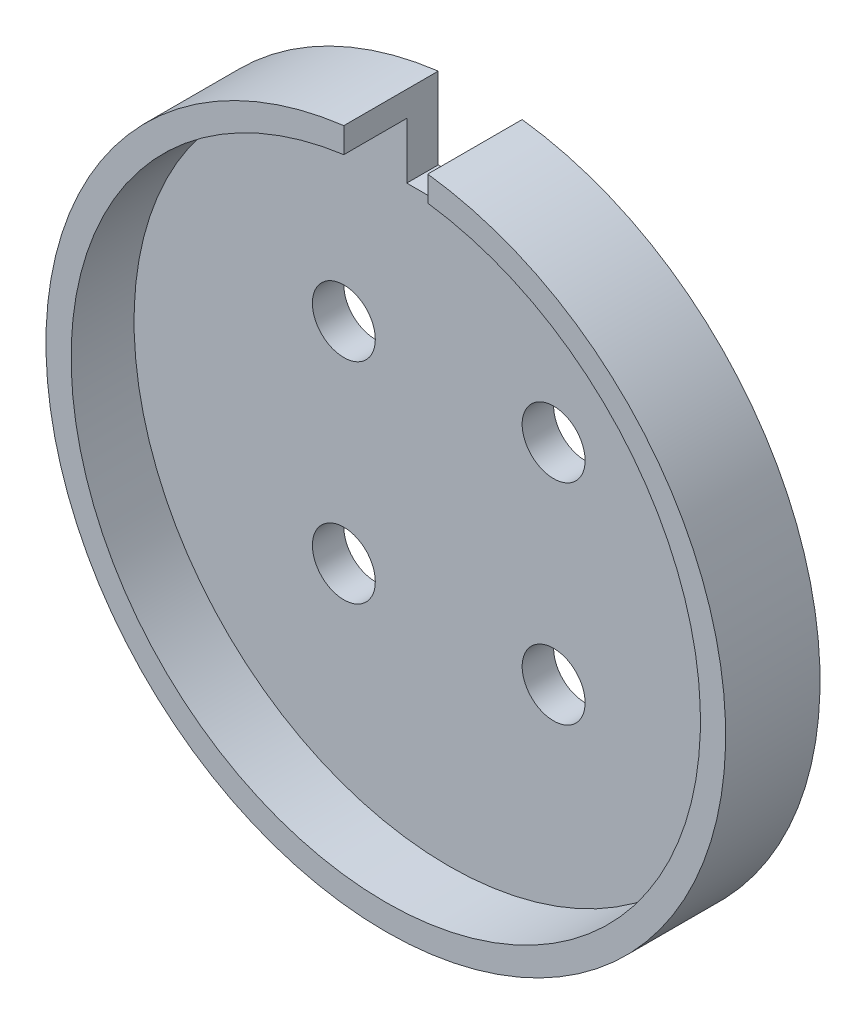
ISO-10303-21;
HEADER;
FILE_DESCRIPTION(('STEP AP214'),'2;1');
FILE_NAME('part.step','',(''),(''),'','','');
FILE_SCHEMA(('AUTOMOTIVE_DESIGN { 1 0 10303 214 1 1 1 1 }'));
ENDSEC;
DATA;
#1=APPLICATION_CONTEXT('core data for automotive mechanical design processes');
#2=APPLICATION_PROTOCOL_DEFINITION('international standard','automotive_design',2000,#1);
#3=PRODUCT_CONTEXT('',#1,'mechanical');
#4=PRODUCT('Part','Part','',(#3));
#5=PRODUCT_RELATED_PRODUCT_CATEGORY('part','',(#4));
#6=PRODUCT_DEFINITION_FORMATION('','',#4);
#7=PRODUCT_DEFINITION_CONTEXT('part definition',#1,'design');
#8=PRODUCT_DEFINITION('design','',#6,#7);
#9=PRODUCT_DEFINITION_SHAPE('','',#8);
#10=(LENGTH_UNIT() NAMED_UNIT(*) SI_UNIT(.MILLI.,.METRE.));
#11=(NAMED_UNIT(*) PLANE_ANGLE_UNIT() SI_UNIT($,.RADIAN.));
#12=(NAMED_UNIT(*) SI_UNIT($,.STERADIAN.) SOLID_ANGLE_UNIT());
#13=UNCERTAINTY_MEASURE_WITH_UNIT(LENGTH_MEASURE(1.E-05),#10,'distance_accuracy_value','');
#14=(GEOMETRIC_REPRESENTATION_CONTEXT(3) GLOBAL_UNCERTAINTY_ASSIGNED_CONTEXT((#13)) GLOBAL_UNIT_ASSIGNED_CONTEXT((#10,
#11,#12)) REPRESENTATION_CONTEXT('',''));
#15=CARTESIAN_POINT('',(0.,0.,0.));
#16=DIRECTION('',(0.,0.,1.));
#17=DIRECTION('',(1.,0.,0.));
#18=AXIS2_PLACEMENT_3D('',#15,#16,#17);
#19=CARTESIAN_POINT('',(-46.5214559661407,2.78795455574518,1.5));
#20=DIRECTION('',(0.,0.,-1.));
#21=DIRECTION('',(-1.,0.,0.));
#22=AXIS2_PLACEMENT_3D('',#19,#20,#21);
#23=PLANE('',#22);
#24=CARTESIAN_POINT('',(-41.5214559661408,7.78795455574518,1.5));
#25=DIRECTION('',(0.,0.,1.));
#26=DIRECTION('',(1.,0.,0.));
#27=AXIS2_PLACEMENT_3D('',#24,#25,#26);
#28=CIRCLE('',#27,1.5);
#29=CARTESIAN_POINT('',(-40.0214559661408,7.78795455574518,1.5));
#30=VERTEX_POINT('',#29);
#31=EDGE_CURVE('E134',#30,#30,#28,.T.);
#32=ORIENTED_EDGE('',*,*,#31,.F.);
#33=EDGE_LOOP('',(#32));
#34=FACE_BOUND('',#33,.T.);
#35=CARTESIAN_POINT('',(-51.5214559661408,7.78795455574511,1.5));
#36=DIRECTION('',(0.,0.,1.));
#37=DIRECTION('',(1.,0.,0.));
#38=AXIS2_PLACEMENT_3D('',#35,#36,#37);
#39=CIRCLE('',#38,1.5);
#40=CARTESIAN_POINT('',(-50.0214559661408,7.78795455574511,1.5));
#41=VERTEX_POINT('',#40);
#42=EDGE_CURVE('E143',#41,#41,#39,.T.);
#43=ORIENTED_EDGE('',*,*,#42,.F.);
#44=EDGE_LOOP('',(#43));
#45=FACE_BOUND('',#44,.T.);
#46=CARTESIAN_POINT('',(-51.5214559661407,-2.21204544425489,1.5));
#47=DIRECTION('',(0.,0.,1.));
#48=DIRECTION('',(1.,0.,0.));
#49=AXIS2_PLACEMENT_3D('',#46,#47,#48);
#50=CIRCLE('',#49,1.5);
#51=CARTESIAN_POINT('',(-50.0214559661407,-2.21204544425489,1.5));
#52=VERTEX_POINT('',#51);
#53=EDGE_CURVE('E149',#52,#52,#50,.T.);
#54=ORIENTED_EDGE('',*,*,#53,.F.);
#55=EDGE_LOOP('',(#54));
#56=FACE_BOUND('',#55,.T.);
#57=CARTESIAN_POINT('',(-41.5214559661407,-2.21204544425482,1.5));
#58=DIRECTION('',(0.,0.,1.));
#59=DIRECTION('',(1.,0.,0.));
#60=AXIS2_PLACEMENT_3D('',#57,#58,#59);
#61=CIRCLE('',#60,1.5);
#62=CARTESIAN_POINT('',(-40.0214559661407,-2.21204544425482,1.5));
#63=VERTEX_POINT('',#62);
#64=EDGE_CURVE('E102',#63,#63,#61,.T.);
#65=ORIENTED_EDGE('',*,*,#64,.F.);
#66=EDGE_LOOP('',(#65));
#67=FACE_BOUND('',#66,.T.);
#68=CARTESIAN_POINT('',(-46.522232832183,2.79785048504915,1.5));
#69=DIRECTION('',(0.,0.,-1.));
#70=DIRECTION('',(1.,0.,0.));
#71=AXIS2_PLACEMENT_3D('',#68,#69,#70);
#72=CIRCLE('',#71,15.);
#73=CARTESIAN_POINT('',(-44.5214559661407,17.6638146963713,1.5));
#74=VERTEX_POINT('',#73);
#75=CARTESIAN_POINT('',(-48.5214559661407,17.664023727032,1.5));
#76=VERTEX_POINT('',#75);
#77=EDGE_CURVE('E48',#74,#76,#72,.T.);
#78=ORIENTED_EDGE('',*,*,#77,.F.);
#79=DIRECTION('',(0.,-1.,0.));
#80=VECTOR('',#79,1.);
#81=CARTESIAN_POINT('',(-44.5214559661407,14.9903333843826,1.5));
#82=LINE('',#81,#80);
#83=CARTESIAN_POINT('',(-44.5214559661407,14.9903333843826,1.5));
#84=VERTEX_POINT('',#83);
#85=EDGE_CURVE('E86',#74,#84,#82,.T.);
#86=ORIENTED_EDGE('',*,*,#85,.T.);
#87=DIRECTION('',(-1.,0.,0.));
#88=VECTOR('',#87,1.);
#89=CARTESIAN_POINT('',(-44.5214559661407,14.9903333843826,1.5));
#90=LINE('',#89,#88);
#91=CARTESIAN_POINT('',(-48.5214559661407,14.9903333843826,1.5));
#92=VERTEX_POINT('',#91);
#93=EDGE_CURVE('E54',#84,#92,#90,.T.);
#94=ORIENTED_EDGE('',*,*,#93,.T.);
#95=DIRECTION('',(0.,1.,0.));
#96=VECTOR('',#95,1.);
#97=CARTESIAN_POINT('',(-48.5214559661407,14.9903333843826,1.5));
#98=LINE('',#97,#96);
#99=EDGE_CURVE('E97',#92,#76,#98,.T.);
#100=ORIENTED_EDGE('',*,*,#99,.T.);
#101=EDGE_LOOP('',(#78,#86,#94,#100));
#102=FACE_BOUND('',#101,.T.);
#103=ADVANCED_FACE('F33',(#34,#45,#56,#67,#102),#23,.F.);
#104=CARTESIAN_POINT('',(-46.5214559661407,2.78795455574518,0.));
#105=DIRECTION('',(0.,0.,-1.));
#106=DIRECTION('',(-1.,0.,0.));
#107=AXIS2_PLACEMENT_3D('',#104,#105,#106);
#108=PLANE('',#107);
#109=CARTESIAN_POINT('',(-51.5214559661408,7.78795455574511,0.));
#110=DIRECTION('',(0.,0.,1.));
#111=DIRECTION('',(1.,0.,0.));
#112=AXIS2_PLACEMENT_3D('',#109,#110,#111);
#113=CIRCLE('',#112,1.5);
#114=CARTESIAN_POINT('',(-50.0214559661408,7.78795455574511,0.));
#115=VERTEX_POINT('',#114);
#116=EDGE_CURVE('E141',#115,#115,#113,.T.);
#117=ORIENTED_EDGE('',*,*,#116,.T.);
#118=EDGE_LOOP('',(#117));
#119=FACE_BOUND('',#118,.T.);
#120=CARTESIAN_POINT('',(-41.5214559661407,-2.21204544425482,0.));
#121=DIRECTION('',(0.,0.,1.));
#122=DIRECTION('',(1.,0.,0.));
#123=AXIS2_PLACEMENT_3D('',#120,#121,#122);
#124=CIRCLE('',#123,1.5);
#125=CARTESIAN_POINT('',(-40.0214559661407,-2.21204544425482,0.));
#126=VERTEX_POINT('',#125);
#127=EDGE_CURVE('E106',#126,#126,#124,.T.);
#128=ORIENTED_EDGE('',*,*,#127,.T.);
#129=EDGE_LOOP('',(#128));
#130=FACE_BOUND('',#129,.T.);
#131=DIRECTION('',(0.,-1.,0.));
#132=VECTOR('',#131,1.);
#133=CARTESIAN_POINT('',(-44.5214559661407,14.9903333843826,0.));
#134=LINE('',#133,#132);
#135=CARTESIAN_POINT('',(-44.5214559661407,18.864023727032,0.));
#136=VERTEX_POINT('',#135);
#137=CARTESIAN_POINT('',(-44.5214559661407,14.9903333843826,0.));
#138=VERTEX_POINT('',#137);
#139=EDGE_CURVE('E92',#136,#138,#134,.T.);
#140=ORIENTED_EDGE('',*,*,#139,.F.);
#141=CARTESIAN_POINT('',(-46.5214559661407,2.78795455574518,0.));
#142=DIRECTION('',(0.,0.,1.));
#143=DIRECTION('',(-1.,0.,0.));
#144=AXIS2_PLACEMENT_3D('',#141,#142,#143);
#145=CIRCLE('',#144,16.2);
#146=CARTESIAN_POINT('',(-48.5214559661407,18.864023727032,0.));
#147=VERTEX_POINT('',#146);
#148=EDGE_CURVE('E74',#147,#136,#145,.T.);
#149=ORIENTED_EDGE('',*,*,#148,.F.);
#150=DIRECTION('',(0.,1.,0.));
#151=VECTOR('',#150,1.);
#152=CARTESIAN_POINT('',(-48.5214559661407,14.9903333843826,0.));
#153=LINE('',#152,#151);
#154=CARTESIAN_POINT('',(-48.5214559661407,14.9903333843826,0.));
#155=VERTEX_POINT('',#154);
#156=EDGE_CURVE('E87',#155,#147,#153,.T.);
#157=ORIENTED_EDGE('',*,*,#156,.F.);
#158=DIRECTION('',(-1.,0.,0.));
#159=VECTOR('',#158,1.);
#160=CARTESIAN_POINT('',(-44.5214559661407,14.9903333843826,0.));
#161=LINE('',#160,#159);
#162=EDGE_CURVE('E101',#138,#155,#161,.T.);
#163=ORIENTED_EDGE('',*,*,#162,.F.);
#164=EDGE_LOOP('',(#140,#149,#157,#163));
#165=FACE_BOUND('',#164,.T.);
#166=CARTESIAN_POINT('',(-51.5214559661407,-2.21204544425489,0.));
#167=DIRECTION('',(0.,0.,1.));
#168=DIRECTION('',(1.,0.,0.));
#169=AXIS2_PLACEMENT_3D('',#166,#167,#168);
#170=CIRCLE('',#169,1.5);
#171=CARTESIAN_POINT('',(-50.0214559661407,-2.21204544425489,0.));
#172=VERTEX_POINT('',#171);
#173=EDGE_CURVE('E146',#172,#172,#170,.T.);
#174=ORIENTED_EDGE('',*,*,#173,.T.);
#175=EDGE_LOOP('',(#174));
#176=FACE_BOUND('',#175,.T.);
#177=CARTESIAN_POINT('',(-41.5214559661408,7.78795455574518,0.));
#178=DIRECTION('',(0.,0.,1.));
#179=DIRECTION('',(1.,0.,0.));
#180=AXIS2_PLACEMENT_3D('',#177,#178,#179);
#181=CIRCLE('',#180,1.5);
#182=CARTESIAN_POINT('',(-40.0214559661408,7.78795455574518,0.));
#183=VERTEX_POINT('',#182);
#184=EDGE_CURVE('E130',#183,#183,#181,.T.);
#185=ORIENTED_EDGE('',*,*,#184,.T.);
#186=EDGE_LOOP('',(#185));
#187=FACE_BOUND('',#186,.T.);
#188=ADVANCED_FACE('F99',(#119,#130,#165,#176,#187),#108,.T.);
#189=CARTESIAN_POINT('',(-44.5214559661407,14.9903333843826,1.5));
#190=DIRECTION('',(1.,0.,0.));
#191=DIRECTION('',(0.,0.,-1.));
#192=AXIS2_PLACEMENT_3D('',#189,#190,#191);
#193=PLANE('',#192);
#194=ORIENTED_EDGE('',*,*,#139,.T.);
#195=DIRECTION('',(0.,0.,-1.));
#196=VECTOR('',#195,1.);
#197=CARTESIAN_POINT('',(-44.5214559661407,14.9903333843826,1.5));
#198=LINE('',#197,#196);
#199=EDGE_CURVE('E11',#84,#138,#198,.T.);
#200=ORIENTED_EDGE('',*,*,#199,.F.);
#201=ORIENTED_EDGE('',*,*,#85,.F.);
#202=DIRECTION('',(0.,0.,-1.));
#203=VECTOR('',#202,1.);
#204=CARTESIAN_POINT('',(-44.5214559661407,17.6638146963713,4.5));
#205=LINE('',#204,#203);
#206=CARTESIAN_POINT('',(-44.5214559661407,17.6638146963713,4.5));
#207=VERTEX_POINT('',#206);
#208=EDGE_CURVE('E121',#207,#74,#205,.T.);
#209=ORIENTED_EDGE('',*,*,#208,.F.);
#210=DIRECTION('',(0.,-1.,0.));
#211=VECTOR('',#210,1.);
#212=CARTESIAN_POINT('',(-44.5214559661407,18.864023727032,4.5));
#213=LINE('',#212,#211);
#214=CARTESIAN_POINT('',(-44.5214559661407,18.864023727032,4.5));
#215=VERTEX_POINT('',#214);
#216=EDGE_CURVE('E95',#215,#207,#213,.T.);
#217=ORIENTED_EDGE('',*,*,#216,.F.);
#218=DIRECTION('',(0.,0.,-1.));
#219=VECTOR('',#218,1.);
#220=CARTESIAN_POINT('',(-44.5214559661407,18.864023727032,1.5));
#221=LINE('',#220,#219);
#222=EDGE_CURVE('E79',#215,#136,#221,.T.);
#223=ORIENTED_EDGE('',*,*,#222,.T.);
#224=EDGE_LOOP('',(#194,#200,#201,#209,#217,#223));
#225=FACE_BOUND('',#224,.T.);
#226=ADVANCED_FACE('F35',(#225),#193,.F.);
#227=CARTESIAN_POINT('',(-44.5214559661407,14.9903333843826,1.5));
#228=DIRECTION('',(0.,-1.,0.));
#229=DIRECTION('',(1.,0.,0.));
#230=AXIS2_PLACEMENT_3D('',#227,#228,#229);
#231=PLANE('',#230);
#232=ORIENTED_EDGE('',*,*,#162,.T.);
#233=DIRECTION('',(0.,0.,-1.));
#234=VECTOR('',#233,1.);
#235=CARTESIAN_POINT('',(-48.5214559661407,14.9903333843826,1.5));
#236=LINE('',#235,#234);
#237=EDGE_CURVE('E41',#92,#155,#236,.T.);
#238=ORIENTED_EDGE('',*,*,#237,.F.);
#239=ORIENTED_EDGE('',*,*,#93,.F.);
#240=ORIENTED_EDGE('',*,*,#199,.T.);
#241=EDGE_LOOP('',(#232,#238,#239,#240));
#242=FACE_BOUND('',#241,.T.);
#243=ADVANCED_FACE('F118',(#242),#231,.F.);
#244=CARTESIAN_POINT('',(-48.5214559661407,14.9903333843826,1.5));
#245=DIRECTION('',(-1.,0.,0.));
#246=DIRECTION('',(0.,0.,1.));
#247=AXIS2_PLACEMENT_3D('',#244,#245,#246);
#248=PLANE('',#247);
#249=ORIENTED_EDGE('',*,*,#156,.T.);
#250=DIRECTION('',(0.,0.,-1.));
#251=VECTOR('',#250,1.);
#252=CARTESIAN_POINT('',(-48.5214559661407,18.864023727032,1.5));
#253=LINE('',#252,#251);
#254=CARTESIAN_POINT('',(-48.5214559661407,18.864023727032,4.5));
#255=VERTEX_POINT('',#254);
#256=EDGE_CURVE('E82',#255,#147,#253,.T.);
#257=ORIENTED_EDGE('',*,*,#256,.F.);
#258=DIRECTION('',(0.,1.,0.));
#259=VECTOR('',#258,1.);
#260=CARTESIAN_POINT('',(-48.5214559661407,18.864023727032,4.5));
#261=LINE('',#260,#259);
#262=CARTESIAN_POINT('',(-48.5214559661407,17.664023727032,4.5));
#263=VERTEX_POINT('',#262);
#264=EDGE_CURVE('E136',#263,#255,#261,.T.);
#265=ORIENTED_EDGE('',*,*,#264,.F.);
#266=DIRECTION('',(0.,0.,-1.));
#267=VECTOR('',#266,1.);
#268=CARTESIAN_POINT('',(-48.5214559661407,17.664023727032,4.5));
#269=LINE('',#268,#267);
#270=EDGE_CURVE('E131',#263,#76,#269,.T.);
#271=ORIENTED_EDGE('',*,*,#270,.T.);
#272=ORIENTED_EDGE('',*,*,#99,.F.);
#273=ORIENTED_EDGE('',*,*,#237,.T.);
#274=EDGE_LOOP('',(#249,#257,#265,#271,#272,#273));
#275=FACE_BOUND('',#274,.T.);
#276=ADVANCED_FACE('F115',(#275),#248,.F.);
#277=CARTESIAN_POINT('',(-46.5214559661407,2.78795455574518,1.5));
#278=DIRECTION('',(0.,0.,-1.));
#279=DIRECTION('',(-1.,0.,0.));
#280=AXIS2_PLACEMENT_3D('',#277,#278,#279);
#281=CYLINDRICAL_SURFACE('',#280,16.2);
#282=ORIENTED_EDGE('',*,*,#148,.T.);
#283=ORIENTED_EDGE('',*,*,#222,.F.);
#284=CARTESIAN_POINT('',(-46.5214559661407,2.78795455574517,4.5));
#285=DIRECTION('',(0.,0.,1.));
#286=DIRECTION('',(1.,0.,0.));
#287=AXIS2_PLACEMENT_3D('',#284,#285,#286);
#288=CIRCLE('',#287,16.2);
#289=EDGE_CURVE('E163',#255,#215,#288,.T.);
#290=ORIENTED_EDGE('',*,*,#289,.F.);
#291=ORIENTED_EDGE('',*,*,#256,.T.);
#292=EDGE_LOOP('',(#282,#283,#290,#291));
#293=FACE_BOUND('',#292,.T.);
#294=ADVANCED_FACE('F76',(#293),#281,.T.);
#295=CARTESIAN_POINT('',(-41.5214559661407,-2.21204544425482,1.5));
#296=DIRECTION('',(0.,0.,-1.));
#297=DIRECTION('',(-1.,0.,0.));
#298=AXIS2_PLACEMENT_3D('',#295,#296,#297);
#299=CYLINDRICAL_SURFACE('',#298,1.5);
#300=ORIENTED_EDGE('',*,*,#64,.T.);
#301=EDGE_LOOP('',(#300));
#302=FACE_BOUND('',#301,.T.);
#303=ORIENTED_EDGE('',*,*,#127,.F.);
#304=EDGE_LOOP('',(#303));
#305=FACE_BOUND('',#304,.T.);
#306=ADVANCED_FACE('F187',(#302,#305),#299,.F.);
#307=CARTESIAN_POINT('',(-51.5214559661407,-2.21204544425489,1.5));
#308=DIRECTION('',(0.,0.,-1.));
#309=DIRECTION('',(-1.,0.,0.));
#310=AXIS2_PLACEMENT_3D('',#307,#308,#309);
#311=CYLINDRICAL_SURFACE('',#310,1.5);
#312=ORIENTED_EDGE('',*,*,#53,.T.);
#313=EDGE_LOOP('',(#312));
#314=FACE_BOUND('',#313,.T.);
#315=ORIENTED_EDGE('',*,*,#173,.F.);
#316=EDGE_LOOP('',(#315));
#317=FACE_BOUND('',#316,.T.);
#318=ADVANCED_FACE('F219',(#314,#317),#311,.F.);
#319=CARTESIAN_POINT('',(-51.5214559661408,7.78795455574511,1.5));
#320=DIRECTION('',(0.,0.,-1.));
#321=DIRECTION('',(-1.,0.,0.));
#322=AXIS2_PLACEMENT_3D('',#319,#320,#321);
#323=CYLINDRICAL_SURFACE('',#322,1.5);
#324=ORIENTED_EDGE('',*,*,#42,.T.);
#325=EDGE_LOOP('',(#324));
#326=FACE_BOUND('',#325,.T.);
#327=ORIENTED_EDGE('',*,*,#116,.F.);
#328=EDGE_LOOP('',(#327));
#329=FACE_BOUND('',#328,.T.);
#330=ADVANCED_FACE('F229',(#326,#329),#323,.F.);
#331=CARTESIAN_POINT('',(-41.5214559661408,7.78795455574518,1.5));
#332=DIRECTION('',(0.,0.,-1.));
#333=DIRECTION('',(-1.,0.,0.));
#334=AXIS2_PLACEMENT_3D('',#331,#332,#333);
#335=CYLINDRICAL_SURFACE('',#334,1.5);
#336=ORIENTED_EDGE('',*,*,#31,.T.);
#337=EDGE_LOOP('',(#336));
#338=FACE_BOUND('',#337,.T.);
#339=ORIENTED_EDGE('',*,*,#184,.F.);
#340=EDGE_LOOP('',(#339));
#341=FACE_BOUND('',#340,.T.);
#342=ADVANCED_FACE('F174',(#338,#341),#335,.F.);
#343=CARTESIAN_POINT('',(-46.522232832183,2.79785048504915,4.5));
#344=DIRECTION('',(0.,0.,-1.));
#345=DIRECTION('',(-1.,0.,0.));
#346=AXIS2_PLACEMENT_3D('',#343,#344,#345);
#347=CYLINDRICAL_SURFACE('',#346,15.);
#348=ORIENTED_EDGE('',*,*,#77,.T.);
#349=ORIENTED_EDGE('',*,*,#270,.F.);
#350=CARTESIAN_POINT('',(-46.522232832183,2.79785048504915,4.5));
#351=DIRECTION('',(0.,0.,-1.));
#352=DIRECTION('',(1.,0.,0.));
#353=AXIS2_PLACEMENT_3D('',#350,#351,#352);
#354=CIRCLE('',#353,15.);
#355=EDGE_CURVE('E129',#207,#263,#354,.T.);
#356=ORIENTED_EDGE('',*,*,#355,.F.);
#357=ORIENTED_EDGE('',*,*,#208,.T.);
#358=EDGE_LOOP('',(#348,#349,#356,#357));
#359=FACE_BOUND('',#358,.T.);
#360=ADVANCED_FACE('F125',(#359),#347,.F.);
#361=CARTESIAN_POINT('',(-46.5214559661407,2.78795455574517,4.5));
#362=DIRECTION('',(0.,0.,1.));
#363=DIRECTION('',(1.,0.,0.));
#364=AXIS2_PLACEMENT_3D('',#361,#362,#363);
#365=PLANE('',#364);
#366=ORIENTED_EDGE('',*,*,#289,.T.);
#367=ORIENTED_EDGE('',*,*,#216,.T.);
#368=ORIENTED_EDGE('',*,*,#355,.T.);
#369=ORIENTED_EDGE('',*,*,#264,.T.);
#370=EDGE_LOOP('',(#366,#367,#368,#369));
#371=FACE_BOUND('',#370,.T.);
#372=ADVANCED_FACE('F161',(#371),#365,.T.);
#373=CLOSED_SHELL('',(#103,#188,#226,#243,#276,#294,#306,#318,#330,#342,#360,#372));
#374=MANIFOLD_SOLID_BREP('B2',#373);
#375=ADVANCED_BREP_SHAPE_REPRESENTATION('',(#18,#374),#14);
#376=SHAPE_DEFINITION_REPRESENTATION(#9,#375);
ENDSEC;
END-ISO-10303-21;
